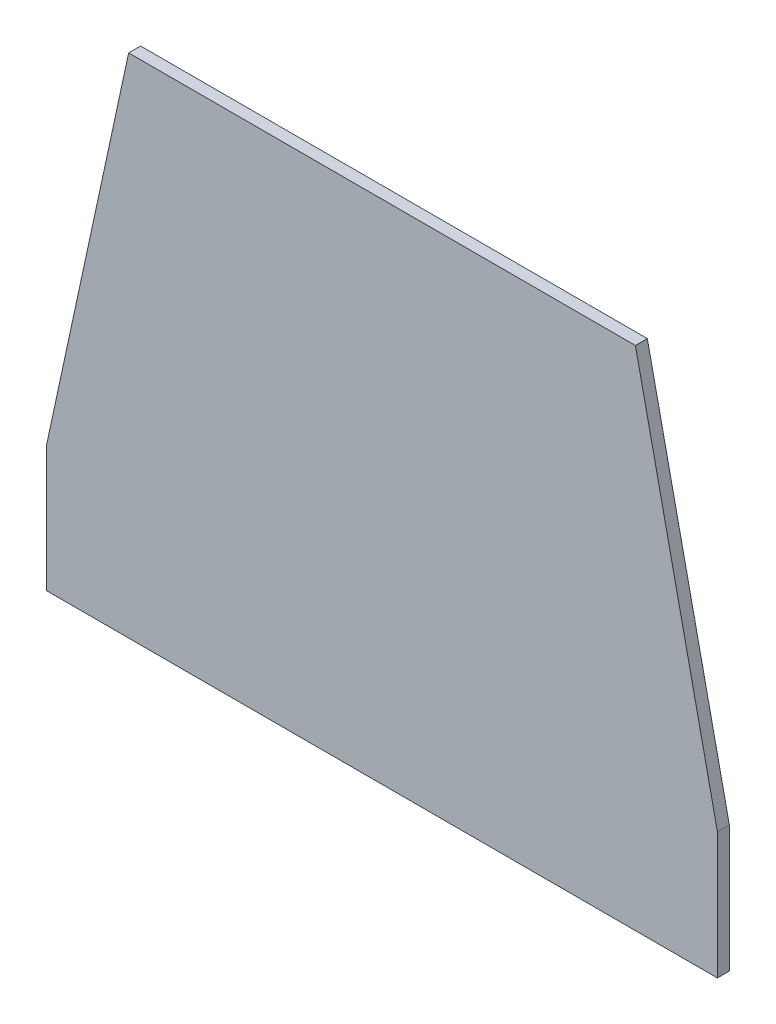
ISO-10303-21;
HEADER;
FILE_DESCRIPTION(('STEP AP214'),'2;1');
FILE_NAME('part.step','',(''),(''),'','','');
FILE_SCHEMA(('AUTOMOTIVE_DESIGN { 1 0 10303 214 1 1 1 1 }'));
ENDSEC;
DATA;
#1=APPLICATION_CONTEXT('core data for automotive mechanical design processes');
#2=APPLICATION_PROTOCOL_DEFINITION('international standard','automotive_design',2000,#1);
#3=PRODUCT_CONTEXT('',#1,'mechanical');
#4=PRODUCT('Part','Part','',(#3));
#5=PRODUCT_RELATED_PRODUCT_CATEGORY('part','',(#4));
#6=PRODUCT_DEFINITION_FORMATION('','',#4);
#7=PRODUCT_DEFINITION_CONTEXT('part definition',#1,'design');
#8=PRODUCT_DEFINITION('design','',#6,#7);
#9=PRODUCT_DEFINITION_SHAPE('','',#8);
#10=(LENGTH_UNIT() NAMED_UNIT(*) SI_UNIT(.MILLI.,.METRE.));
#11=(NAMED_UNIT(*) PLANE_ANGLE_UNIT() SI_UNIT($,.RADIAN.));
#12=(NAMED_UNIT(*) SI_UNIT($,.STERADIAN.) SOLID_ANGLE_UNIT());
#13=UNCERTAINTY_MEASURE_WITH_UNIT(LENGTH_MEASURE(1.E-05),#10,'distance_accuracy_value','');
#14=(GEOMETRIC_REPRESENTATION_CONTEXT(3) GLOBAL_UNCERTAINTY_ASSIGNED_CONTEXT((#13)) GLOBAL_UNIT_ASSIGNED_CONTEXT((#10,
#11,#12)) REPRESENTATION_CONTEXT('',''));
#15=CARTESIAN_POINT('',(0.,0.,0.));
#16=DIRECTION('',(0.,0.,1.));
#17=DIRECTION('',(1.,0.,0.));
#18=AXIS2_PLACEMENT_3D('',#15,#16,#17);
#19=CARTESIAN_POINT('',(0.,0.,16.));
#20=DIRECTION('',(0.,0.,-1.));
#21=DIRECTION('',(-1.,0.,0.));
#22=AXIS2_PLACEMENT_3D('',#19,#20,#21);
#23=PLANE('',#22);
#24=DIRECTION('',(0.,-1.,0.));
#25=VECTOR('',#24,1.);
#26=CARTESIAN_POINT('',(0.,0.,16.));
#27=LINE('',#26,#25);
#28=CARTESIAN_POINT('',(0.,170.,16.));
#29=VERTEX_POINT('',#28);
#30=CARTESIAN_POINT('',(0.,0.,16.));
#31=VERTEX_POINT('',#30);
#32=EDGE_CURVE('E126',#29,#31,#27,.T.);
#33=ORIENTED_EDGE('',*,*,#32,.T.);
#34=DIRECTION('',(1.,0.,0.));
#35=VECTOR('',#34,1.);
#36=CARTESIAN_POINT('',(0.,0.,16.));
#37=LINE('',#36,#35);
#38=CARTESIAN_POINT('',(900.,0.,16.));
#39=VERTEX_POINT('',#38);
#40=EDGE_CURVE('E86',#31,#39,#37,.T.);
#41=ORIENTED_EDGE('',*,*,#40,.T.);
#42=DIRECTION('',(0.,1.,0.));
#43=VECTOR('',#42,1.);
#44=CARTESIAN_POINT('',(900.,0.,16.));
#45=LINE('',#44,#43);
#46=CARTESIAN_POINT('',(900.,170.,16.));
#47=VERTEX_POINT('',#46);
#48=EDGE_CURVE('E98',#39,#47,#45,.T.);
#49=ORIENTED_EDGE('',*,*,#48,.T.);
#50=DIRECTION('',(-0.210837872253052,0.977521044082329,0.));
#51=VECTOR('',#50,1.);
#52=CARTESIAN_POINT('',(790.,680.,16.));
#53=LINE('',#52,#51);
#54=CARTESIAN_POINT('',(790.,680.,16.));
#55=VERTEX_POINT('',#54);
#56=EDGE_CURVE('E93',#47,#55,#53,.T.);
#57=ORIENTED_EDGE('',*,*,#56,.T.);
#58=DIRECTION('',(-1.,0.,0.));
#59=VECTOR('',#58,1.);
#60=CARTESIAN_POINT('',(110.,680.,16.));
#61=LINE('',#60,#59);
#62=CARTESIAN_POINT('',(110.,680.,16.));
#63=VERTEX_POINT('',#62);
#64=EDGE_CURVE('E96',#55,#63,#61,.T.);
#65=ORIENTED_EDGE('',*,*,#64,.T.);
#66=DIRECTION('',(-0.210837872253051,-0.977521044082329,0.));
#67=VECTOR('',#66,1.);
#68=CARTESIAN_POINT('',(110.,680.,16.));
#69=LINE('',#68,#67);
#70=EDGE_CURVE('E49',#63,#29,#69,.T.);
#71=ORIENTED_EDGE('',*,*,#70,.T.);
#72=EDGE_LOOP('',(#33,#41,#49,#57,#65,#71));
#73=FACE_BOUND('',#72,.T.);
#74=ADVANCED_FACE('F32',(#73),#23,.F.);
#75=CARTESIAN_POINT('',(0.,0.,0.));
#76=DIRECTION('',(0.,0.,-1.));
#77=DIRECTION('',(-1.,0.,0.));
#78=AXIS2_PLACEMENT_3D('',#75,#76,#77);
#79=PLANE('',#78);
#80=DIRECTION('',(0.,-1.,0.));
#81=VECTOR('',#80,1.);
#82=CARTESIAN_POINT('',(0.,0.,0.));
#83=LINE('',#82,#81);
#84=CARTESIAN_POINT('',(0.,170.,0.));
#85=VERTEX_POINT('',#84);
#86=CARTESIAN_POINT('',(0.,0.,0.));
#87=VERTEX_POINT('',#86);
#88=EDGE_CURVE('E116',#85,#87,#83,.T.);
#89=ORIENTED_EDGE('',*,*,#88,.F.);
#90=DIRECTION('',(-0.210837872253051,-0.977521044082329,0.));
#91=VECTOR('',#90,1.);
#92=CARTESIAN_POINT('',(110.,680.,0.));
#93=LINE('',#92,#91);
#94=CARTESIAN_POINT('',(110.,680.,0.));
#95=VERTEX_POINT('',#94);
#96=EDGE_CURVE('E78',#95,#85,#93,.T.);
#97=ORIENTED_EDGE('',*,*,#96,.F.);
#98=DIRECTION('',(-1.,0.,0.));
#99=VECTOR('',#98,1.);
#100=CARTESIAN_POINT('',(110.,680.,0.));
#101=LINE('',#100,#99);
#102=CARTESIAN_POINT('',(790.,680.,0.));
#103=VERTEX_POINT('',#102);
#104=EDGE_CURVE('E72',#103,#95,#101,.T.);
#105=ORIENTED_EDGE('',*,*,#104,.F.);
#106=DIRECTION('',(-0.210837872253052,0.977521044082329,0.));
#107=VECTOR('',#106,1.);
#108=CARTESIAN_POINT('',(790.,680.,0.));
#109=LINE('',#108,#107);
#110=CARTESIAN_POINT('',(900.,170.,0.));
#111=VERTEX_POINT('',#110);
#112=EDGE_CURVE('E106',#111,#103,#109,.T.);
#113=ORIENTED_EDGE('',*,*,#112,.F.);
#114=DIRECTION('',(0.,1.,0.));
#115=VECTOR('',#114,1.);
#116=CARTESIAN_POINT('',(900.,0.,0.));
#117=LINE('',#116,#115);
#118=CARTESIAN_POINT('',(900.,0.,0.));
#119=VERTEX_POINT('',#118);
#120=EDGE_CURVE('E121',#119,#111,#117,.T.);
#121=ORIENTED_EDGE('',*,*,#120,.F.);
#122=DIRECTION('',(1.,0.,0.));
#123=VECTOR('',#122,1.);
#124=CARTESIAN_POINT('',(0.,0.,0.));
#125=LINE('',#124,#123);
#126=EDGE_CURVE('E119',#87,#119,#125,.T.);
#127=ORIENTED_EDGE('',*,*,#126,.F.);
#128=EDGE_LOOP('',(#89,#97,#105,#113,#121,#127));
#129=FACE_BOUND('',#128,.T.);
#130=ADVANCED_FACE('F135',(#129),#79,.T.);
#131=CARTESIAN_POINT('',(0.,0.,16.));
#132=DIRECTION('',(1.,0.,0.));
#133=DIRECTION('',(0.,0.,-1.));
#134=AXIS2_PLACEMENT_3D('',#131,#132,#133);
#135=PLANE('',#134);
#136=ORIENTED_EDGE('',*,*,#88,.T.);
#137=DIRECTION('',(0.,0.,-1.));
#138=VECTOR('',#137,1.);
#139=CARTESIAN_POINT('',(0.,0.,16.));
#140=LINE('',#139,#138);
#141=EDGE_CURVE('E11',#31,#87,#140,.T.);
#142=ORIENTED_EDGE('',*,*,#141,.F.);
#143=ORIENTED_EDGE('',*,*,#32,.F.);
#144=DIRECTION('',(0.,0.,-1.));
#145=VECTOR('',#144,1.);
#146=CARTESIAN_POINT('',(0.,170.,16.));
#147=LINE('',#146,#145);
#148=EDGE_CURVE('E112',#29,#85,#147,.T.);
#149=ORIENTED_EDGE('',*,*,#148,.T.);
#150=EDGE_LOOP('',(#136,#142,#143,#149));
#151=FACE_BOUND('',#150,.T.);
#152=ADVANCED_FACE('F34',(#151),#135,.F.);
#153=CARTESIAN_POINT('',(0.,0.,16.));
#154=DIRECTION('',(0.,1.,0.));
#155=DIRECTION('',(0.,0.,1.));
#156=AXIS2_PLACEMENT_3D('',#153,#154,#155);
#157=PLANE('',#156);
#158=ORIENTED_EDGE('',*,*,#126,.T.);
#159=DIRECTION('',(0.,0.,-1.));
#160=VECTOR('',#159,1.);
#161=CARTESIAN_POINT('',(900.,0.,16.));
#162=LINE('',#161,#160);
#163=EDGE_CURVE('E41',#39,#119,#162,.T.);
#164=ORIENTED_EDGE('',*,*,#163,.F.);
#165=ORIENTED_EDGE('',*,*,#40,.F.);
#166=ORIENTED_EDGE('',*,*,#141,.T.);
#167=EDGE_LOOP('',(#158,#164,#165,#166));
#168=FACE_BOUND('',#167,.T.);
#169=ADVANCED_FACE('F155',(#168),#157,.F.);
#170=CARTESIAN_POINT('',(900.,0.,16.));
#171=DIRECTION('',(-1.,0.,0.));
#172=DIRECTION('',(0.,-1.,0.));
#173=AXIS2_PLACEMENT_3D('',#170,#171,#172);
#174=PLANE('',#173);
#175=ORIENTED_EDGE('',*,*,#120,.T.);
#176=DIRECTION('',(0.,0.,-1.));
#177=VECTOR('',#176,1.);
#178=CARTESIAN_POINT('',(900.,170.,16.));
#179=LINE('',#178,#177);
#180=EDGE_CURVE('E107',#47,#111,#179,.T.);
#181=ORIENTED_EDGE('',*,*,#180,.F.);
#182=ORIENTED_EDGE('',*,*,#48,.F.);
#183=ORIENTED_EDGE('',*,*,#163,.T.);
#184=EDGE_LOOP('',(#175,#181,#182,#183));
#185=FACE_BOUND('',#184,.T.);
#186=ADVANCED_FACE('F132',(#185),#174,.F.);
#187=CARTESIAN_POINT('',(790.,680.,16.));
#188=DIRECTION('',(-0.977521044082329,-0.210837872253052,0.));
#189=DIRECTION('',(0.210837872253052,-0.977521044082329,0.));
#190=AXIS2_PLACEMENT_3D('',#187,#188,#189);
#191=PLANE('',#190);
#192=ORIENTED_EDGE('',*,*,#112,.T.);
#193=DIRECTION('',(0.,0.,-1.));
#194=VECTOR('',#193,1.);
#195=CARTESIAN_POINT('',(790.,680.,16.));
#196=LINE('',#195,#194);
#197=EDGE_CURVE('E103',#55,#103,#196,.T.);
#198=ORIENTED_EDGE('',*,*,#197,.F.);
#199=ORIENTED_EDGE('',*,*,#56,.F.);
#200=ORIENTED_EDGE('',*,*,#180,.T.);
#201=EDGE_LOOP('',(#192,#198,#199,#200));
#202=FACE_BOUND('',#201,.T.);
#203=ADVANCED_FACE('F104',(#202),#191,.F.);
#204=CARTESIAN_POINT('',(110.,680.,16.));
#205=DIRECTION('',(0.,-1.,0.));
#206=DIRECTION('',(1.,0.,0.));
#207=AXIS2_PLACEMENT_3D('',#204,#205,#206);
#208=PLANE('',#207);
#209=ORIENTED_EDGE('',*,*,#104,.T.);
#210=DIRECTION('',(0.,0.,-1.));
#211=VECTOR('',#210,1.);
#212=CARTESIAN_POINT('',(110.,680.,16.));
#213=LINE('',#212,#211);
#214=EDGE_CURVE('E108',#63,#95,#213,.T.);
#215=ORIENTED_EDGE('',*,*,#214,.F.);
#216=ORIENTED_EDGE('',*,*,#64,.F.);
#217=ORIENTED_EDGE('',*,*,#197,.T.);
#218=EDGE_LOOP('',(#209,#215,#216,#217));
#219=FACE_BOUND('',#218,.T.);
#220=ADVANCED_FACE('F110',(#219),#208,.F.);
#221=CARTESIAN_POINT('',(110.,680.,16.));
#222=DIRECTION('',(0.977521044082329,-0.210837872253051,0.));
#223=DIRECTION('',(0.210837872253051,0.977521044082329,0.));
#224=AXIS2_PLACEMENT_3D('',#221,#222,#223);
#225=PLANE('',#224);
#226=ORIENTED_EDGE('',*,*,#96,.T.);
#227=ORIENTED_EDGE('',*,*,#148,.F.);
#228=ORIENTED_EDGE('',*,*,#70,.F.);
#229=ORIENTED_EDGE('',*,*,#214,.T.);
#230=EDGE_LOOP('',(#226,#227,#228,#229));
#231=FACE_BOUND('',#230,.T.);
#232=ADVANCED_FACE('F139',(#231),#225,.F.);
#233=CLOSED_SHELL('',(#74,#130,#152,#169,#186,#203,#220,#232));
#234=MANIFOLD_SOLID_BREP('B2',#233);
#235=ADVANCED_BREP_SHAPE_REPRESENTATION('',(#18,#234),#14);
#236=SHAPE_DEFINITION_REPRESENTATION(#9,#235);
ENDSEC;
END-ISO-10303-21;
